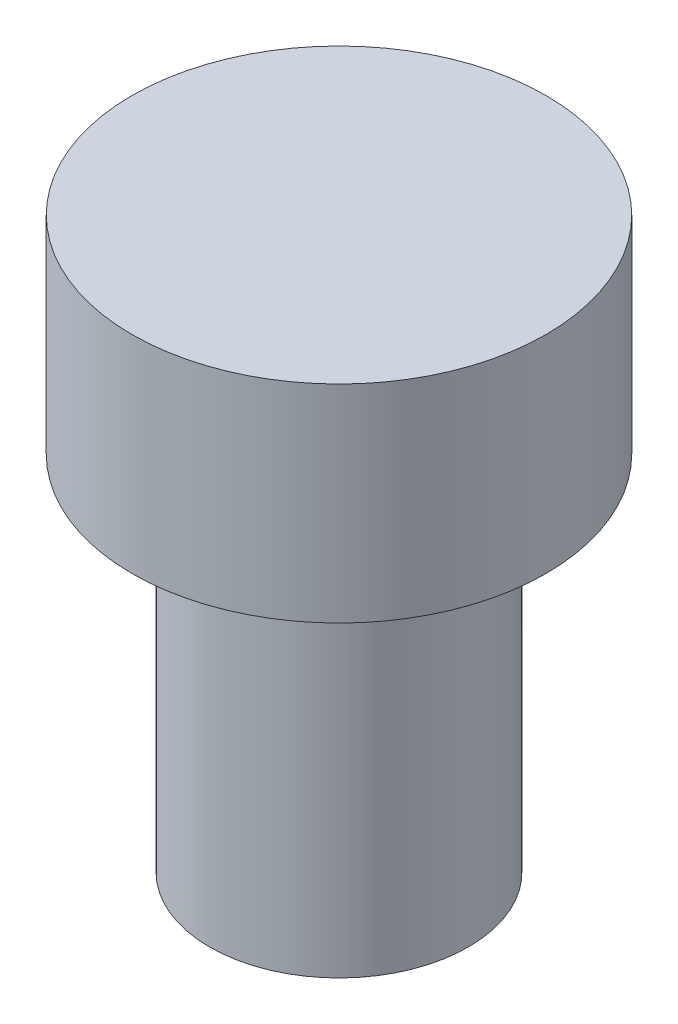
ISO-10303-21;
HEADER;
FILE_DESCRIPTION(('STEP AP214'),'2;1');
FILE_NAME('part.step','',(''),(''),'','','');
FILE_SCHEMA(('AUTOMOTIVE_DESIGN { 1 0 10303 214 1 1 1 1 }'));
ENDSEC;
DATA;
#1=APPLICATION_CONTEXT('core data for automotive mechanical design processes');
#2=APPLICATION_PROTOCOL_DEFINITION('international standard','automotive_design',2000,#1);
#3=PRODUCT_CONTEXT('',#1,'mechanical');
#4=PRODUCT('Part','Part','',(#3));
#5=PRODUCT_RELATED_PRODUCT_CATEGORY('part','',(#4));
#6=PRODUCT_DEFINITION_FORMATION('','',#4);
#7=PRODUCT_DEFINITION_CONTEXT('part definition',#1,'design');
#8=PRODUCT_DEFINITION('design','',#6,#7);
#9=PRODUCT_DEFINITION_SHAPE('','',#8);
#10=(LENGTH_UNIT() NAMED_UNIT(*) SI_UNIT(.MILLI.,.METRE.));
#11=(NAMED_UNIT(*) PLANE_ANGLE_UNIT() SI_UNIT($,.RADIAN.));
#12=(NAMED_UNIT(*) SI_UNIT($,.STERADIAN.) SOLID_ANGLE_UNIT());
#13=UNCERTAINTY_MEASURE_WITH_UNIT(LENGTH_MEASURE(1.E-05),#10,'distance_accuracy_value','');
#14=(GEOMETRIC_REPRESENTATION_CONTEXT(3) GLOBAL_UNCERTAINTY_ASSIGNED_CONTEXT((#13)) GLOBAL_UNIT_ASSIGNED_CONTEXT((#10,
#11,#12)) REPRESENTATION_CONTEXT('',''));
#15=CARTESIAN_POINT('',(0.,0.,0.));
#16=DIRECTION('',(0.,0.,1.));
#17=DIRECTION('',(1.,0.,0.));
#18=AXIS2_PLACEMENT_3D('',#15,#16,#17);
#19=CARTESIAN_POINT('',(0.,7.,0.));
#20=DIRECTION('',(0.,-1.,0.));
#21=DIRECTION('',(0.,0.,-1.));
#22=AXIS2_PLACEMENT_3D('',#19,#20,#21);
#23=CYLINDRICAL_SURFACE('',#22,2.5);
#24=CARTESIAN_POINT('',(0.,7.,0.));
#25=DIRECTION('',(0.,1.,0.));
#26=DIRECTION('',(0.,0.,1.));
#27=AXIS2_PLACEMENT_3D('',#24,#25,#26);
#28=CIRCLE('',#27,2.5);
#29=CARTESIAN_POINT('',(0.,7.,2.5));
#30=VERTEX_POINT('',#29);
#31=EDGE_CURVE('E10',#30,#30,#28,.T.);
#32=ORIENTED_EDGE('',*,*,#31,.F.);
#33=EDGE_LOOP('',(#32));
#34=FACE_BOUND('',#33,.T.);
#35=CARTESIAN_POINT('',(0.,0.,0.));
#36=DIRECTION('',(0.,1.,0.));
#37=DIRECTION('',(0.,0.,1.));
#38=AXIS2_PLACEMENT_3D('',#35,#36,#37);
#39=CIRCLE('',#38,2.5);
#40=CARTESIAN_POINT('',(0.,0.,2.5));
#41=VERTEX_POINT('',#40);
#42=EDGE_CURVE('E46',#41,#41,#39,.T.);
#43=ORIENTED_EDGE('',*,*,#42,.T.);
#44=EDGE_LOOP('',(#43));
#45=FACE_BOUND('',#44,.T.);
#46=ADVANCED_FACE('F43',(#34,#45),#23,.T.);
#47=CARTESIAN_POINT('',(0.,0.,0.));
#48=DIRECTION('',(0.,1.,0.));
#49=DIRECTION('',(0.,0.,1.));
#50=AXIS2_PLACEMENT_3D('',#47,#48,#49);
#51=PLANE('',#50);
#52=ORIENTED_EDGE('',*,*,#42,.F.);
#53=EDGE_LOOP('',(#52));
#54=FACE_BOUND('',#53,.T.);
#55=ADVANCED_FACE('F70',(#54),#51,.F.);
#56=CARTESIAN_POINT('',(0.,11.,0.));
#57=DIRECTION('',(0.,-1.,0.));
#58=DIRECTION('',(0.,0.,-1.));
#59=AXIS2_PLACEMENT_3D('',#56,#57,#58);
#60=CYLINDRICAL_SURFACE('',#59,4.);
#61=CARTESIAN_POINT('',(0.,11.,0.));
#62=DIRECTION('',(0.,1.,0.));
#63=DIRECTION('',(0.,0.,1.));
#64=AXIS2_PLACEMENT_3D('',#61,#62,#63);
#65=CIRCLE('',#64,4.);
#66=CARTESIAN_POINT('',(0.,11.,4.));
#67=VERTEX_POINT('',#66);
#68=EDGE_CURVE('E55',#67,#67,#65,.T.);
#69=ORIENTED_EDGE('',*,*,#68,.F.);
#70=EDGE_LOOP('',(#69));
#71=FACE_BOUND('',#70,.T.);
#72=CARTESIAN_POINT('',(0.,7.,0.));
#73=DIRECTION('',(0.,1.,0.));
#74=DIRECTION('',(0.,0.,1.));
#75=AXIS2_PLACEMENT_3D('',#72,#73,#74);
#76=CIRCLE('',#75,4.);
#77=CARTESIAN_POINT('',(0.,7.,4.));
#78=VERTEX_POINT('',#77);
#79=EDGE_CURVE('E57',#78,#78,#76,.T.);
#80=ORIENTED_EDGE('',*,*,#79,.T.);
#81=EDGE_LOOP('',(#80));
#82=FACE_BOUND('',#81,.T.);
#83=ADVANCED_FACE('F67',(#71,#82),#60,.T.);
#84=CARTESIAN_POINT('',(0.,11.,0.));
#85=DIRECTION('',(0.,1.,0.));
#86=DIRECTION('',(0.,0.,1.));
#87=AXIS2_PLACEMENT_3D('',#84,#85,#86);
#88=PLANE('',#87);
#89=ORIENTED_EDGE('',*,*,#68,.T.);
#90=EDGE_LOOP('',(#89));
#91=FACE_BOUND('',#90,.T.);
#92=ADVANCED_FACE('F65',(#91),#88,.T.);
#93=CARTESIAN_POINT('',(0.,7.,0.));
#94=DIRECTION('',(0.,1.,0.));
#95=DIRECTION('',(0.,0.,1.));
#96=AXIS2_PLACEMENT_3D('',#93,#94,#95);
#97=PLANE('',#96);
#98=ORIENTED_EDGE('',*,*,#31,.T.);
#99=EDGE_LOOP('',(#98));
#100=FACE_BOUND('',#99,.T.);
#101=ORIENTED_EDGE('',*,*,#79,.F.);
#102=EDGE_LOOP('',(#101));
#103=FACE_BOUND('',#102,.T.);
#104=ADVANCED_FACE('F74',(#100,#103),#97,.F.);
#105=CLOSED_SHELL('',(#46,#55,#83,#92,#104));
#106=MANIFOLD_SOLID_BREP('B2',#105);
#107=ADVANCED_BREP_SHAPE_REPRESENTATION('',(#18,#106),#14);
#108=SHAPE_DEFINITION_REPRESENTATION(#9,#107);
ENDSEC;
END-ISO-10303-21;
